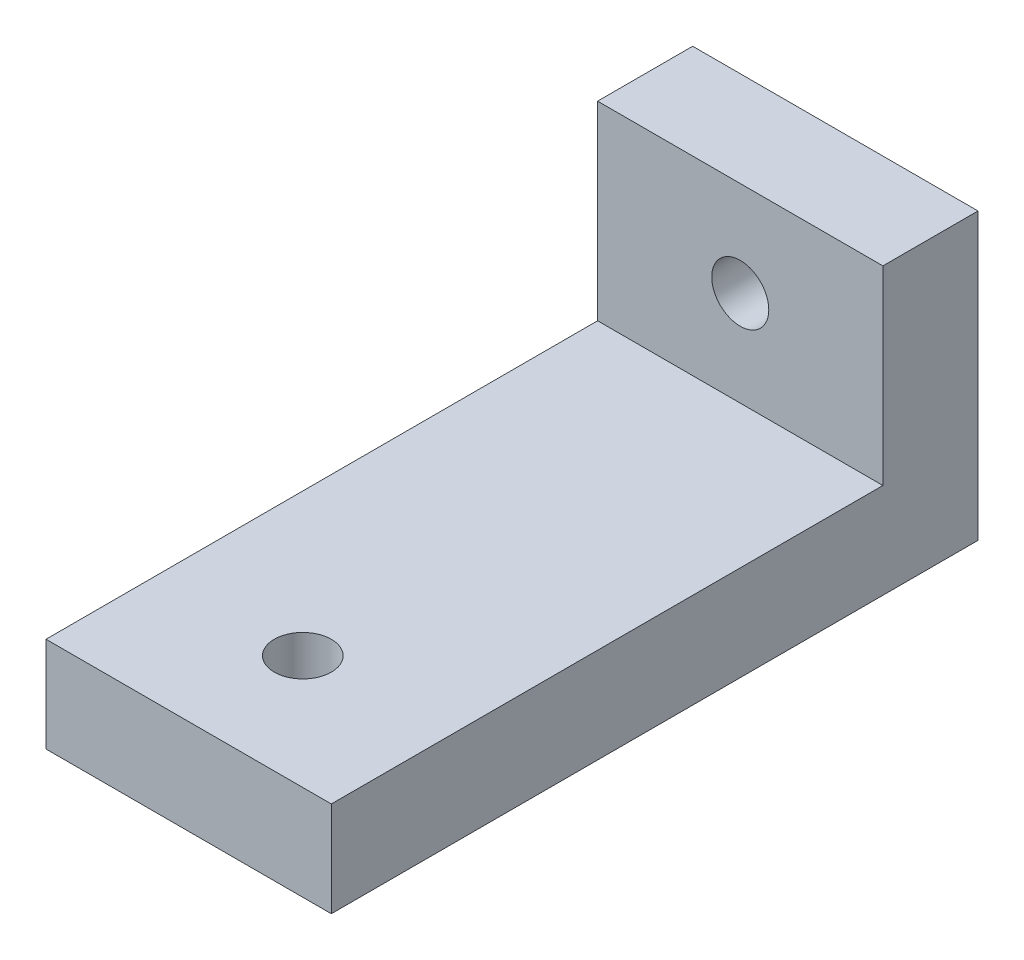
ISO-10303-21;
HEADER;
FILE_DESCRIPTION(('STEP AP214'),'2;1');
FILE_NAME('part.step','',(''),(''),'','','');
FILE_SCHEMA(('AUTOMOTIVE_DESIGN { 1 0 10303 214 1 1 1 1 }'));
ENDSEC;
DATA;
#1=APPLICATION_CONTEXT('core data for automotive mechanical design processes');
#2=APPLICATION_PROTOCOL_DEFINITION('international standard','automotive_design',2000,#1);
#3=PRODUCT_CONTEXT('',#1,'mechanical');
#4=PRODUCT('Part','Part','',(#3));
#5=PRODUCT_RELATED_PRODUCT_CATEGORY('part','',(#4));
#6=PRODUCT_DEFINITION_FORMATION('','',#4);
#7=PRODUCT_DEFINITION_CONTEXT('part definition',#1,'design');
#8=PRODUCT_DEFINITION('design','',#6,#7);
#9=PRODUCT_DEFINITION_SHAPE('','',#8);
#10=(LENGTH_UNIT() NAMED_UNIT(*) SI_UNIT(.MILLI.,.METRE.));
#11=(NAMED_UNIT(*) PLANE_ANGLE_UNIT() SI_UNIT($,.RADIAN.));
#12=(NAMED_UNIT(*) SI_UNIT($,.STERADIAN.) SOLID_ANGLE_UNIT());
#13=UNCERTAINTY_MEASURE_WITH_UNIT(LENGTH_MEASURE(1.E-05),#10,'distance_accuracy_value','');
#14=(GEOMETRIC_REPRESENTATION_CONTEXT(3) GLOBAL_UNCERTAINTY_ASSIGNED_CONTEXT((#13)) GLOBAL_UNIT_ASSIGNED_CONTEXT((#10,
#11,#12)) REPRESENTATION_CONTEXT('',''));
#15=CARTESIAN_POINT('',(0.,0.,0.));
#16=DIRECTION('',(0.,0.,1.));
#17=DIRECTION('',(1.,0.,0.));
#18=AXIS2_PLACEMENT_3D('',#15,#16,#17);
#19=CARTESIAN_POINT('',(7.5,5.,-17.25));
#20=DIRECTION('',(-1.,0.,0.));
#21=DIRECTION('',(0.,0.,1.));
#22=AXIS2_PLACEMENT_3D('',#19,#20,#21);
#23=PLANE('',#22);
#24=DIRECTION('',(0.,-1.,0.));
#25=VECTOR('',#24,1.);
#26=CARTESIAN_POINT('',(7.5,15.,-16.75));
#27=LINE('',#26,#25);
#28=CARTESIAN_POINT('',(7.5,15.,-16.75));
#29=VERTEX_POINT('',#28);
#30=CARTESIAN_POINT('',(7.5,0.,-16.75));
#31=VERTEX_POINT('',#30);
#32=EDGE_CURVE('E159',#29,#31,#27,.T.);
#33=ORIENTED_EDGE('',*,*,#32,.F.);
#34=DIRECTION('',(0.,0.,-1.));
#35=VECTOR('',#34,1.);
#36=CARTESIAN_POINT('',(7.5,15.,-17.25));
#37=LINE('',#36,#35);
#38=CARTESIAN_POINT('',(7.5,15.,-11.75));
#39=VERTEX_POINT('',#38);
#40=EDGE_CURVE('E93',#39,#29,#37,.T.);
#41=ORIENTED_EDGE('',*,*,#40,.F.);
#42=DIRECTION('',(0.,1.,0.));
#43=VECTOR('',#42,1.);
#44=CARTESIAN_POINT('',(7.5,5.,-11.75));
#45=LINE('',#44,#43);
#46=CARTESIAN_POINT('',(7.5,5.,-11.75));
#47=VERTEX_POINT('',#46);
#48=EDGE_CURVE('E152',#47,#39,#45,.T.);
#49=ORIENTED_EDGE('',*,*,#48,.F.);
#50=DIRECTION('',(0.,0.,-1.));
#51=VECTOR('',#50,1.);
#52=CARTESIAN_POINT('',(7.5,5.,-17.25));
#53=LINE('',#52,#51);
#54=CARTESIAN_POINT('',(7.5,5.,17.25));
#55=VERTEX_POINT('',#54);
#56=EDGE_CURVE('E80',#55,#47,#53,.T.);
#57=ORIENTED_EDGE('',*,*,#56,.F.);
#58=DIRECTION('',(0.,-1.,0.));
#59=VECTOR('',#58,1.);
#60=CARTESIAN_POINT('',(7.5,5.,17.25));
#61=LINE('',#60,#59);
#62=CARTESIAN_POINT('',(7.5,0.,17.25));
#63=VERTEX_POINT('',#62);
#64=EDGE_CURVE('E43',#55,#63,#61,.T.);
#65=ORIENTED_EDGE('',*,*,#64,.T.);
#66=DIRECTION('',(0.,0.,-1.));
#67=VECTOR('',#66,1.);
#68=CARTESIAN_POINT('',(7.5,0.,-17.25));
#69=LINE('',#68,#67);
#70=EDGE_CURVE('E87',#63,#31,#69,.T.);
#71=ORIENTED_EDGE('',*,*,#70,.T.);
#72=EDGE_LOOP('',(#33,#41,#49,#57,#65,#71));
#73=FACE_BOUND('',#72,.T.);
#74=ADVANCED_FACE('F35',(#73),#23,.F.);
#75=CARTESIAN_POINT('',(-7.5,5.,-17.25));
#76=DIRECTION('',(1.,0.,0.));
#77=DIRECTION('',(0.,0.,-1.));
#78=AXIS2_PLACEMENT_3D('',#75,#76,#77);
#79=PLANE('',#78);
#80=DIRECTION('',(0.,0.,1.));
#81=VECTOR('',#80,1.);
#82=CARTESIAN_POINT('',(-7.5,5.,-17.25));
#83=LINE('',#82,#81);
#84=CARTESIAN_POINT('',(-7.5,5.,-11.75));
#85=VERTEX_POINT('',#84);
#86=CARTESIAN_POINT('',(-7.5,5.,17.25));
#87=VERTEX_POINT('',#86);
#88=EDGE_CURVE('E117',#85,#87,#83,.T.);
#89=ORIENTED_EDGE('',*,*,#88,.F.);
#90=DIRECTION('',(0.,-1.,0.));
#91=VECTOR('',#90,1.);
#92=CARTESIAN_POINT('',(-7.5,15.,-11.75));
#93=LINE('',#92,#91);
#94=CARTESIAN_POINT('',(-7.5,15.,-11.75));
#95=VERTEX_POINT('',#94);
#96=EDGE_CURVE('E144',#95,#85,#93,.T.);
#97=ORIENTED_EDGE('',*,*,#96,.F.);
#98=DIRECTION('',(0.,0.,1.));
#99=VECTOR('',#98,1.);
#100=CARTESIAN_POINT('',(-7.5,15.,-17.25));
#101=LINE('',#100,#99);
#102=CARTESIAN_POINT('',(-7.5,15.,-16.75));
#103=VERTEX_POINT('',#102);
#104=EDGE_CURVE('E97',#103,#95,#101,.T.);
#105=ORIENTED_EDGE('',*,*,#104,.F.);
#106=DIRECTION('',(0.,1.,0.));
#107=VECTOR('',#106,1.);
#108=CARTESIAN_POINT('',(-7.5,0.,-16.75));
#109=LINE('',#108,#107);
#110=CARTESIAN_POINT('',(-7.5,0.,-16.75));
#111=VERTEX_POINT('',#110);
#112=EDGE_CURVE('E51',#111,#103,#109,.T.);
#113=ORIENTED_EDGE('',*,*,#112,.F.);
#114=DIRECTION('',(0.,0.,1.));
#115=VECTOR('',#114,1.);
#116=CARTESIAN_POINT('',(-7.5,0.,-17.25));
#117=LINE('',#116,#115);
#118=CARTESIAN_POINT('',(-7.5,0.,17.25));
#119=VERTEX_POINT('',#118);
#120=EDGE_CURVE('E81',#111,#119,#117,.T.);
#121=ORIENTED_EDGE('',*,*,#120,.T.);
#122=DIRECTION('',(0.,-1.,0.));
#123=VECTOR('',#122,1.);
#124=CARTESIAN_POINT('',(-7.5,5.,17.25));
#125=LINE('',#124,#123);
#126=EDGE_CURVE('E11',#87,#119,#125,.T.);
#127=ORIENTED_EDGE('',*,*,#126,.F.);
#128=EDGE_LOOP('',(#89,#97,#105,#113,#121,#127));
#129=FACE_BOUND('',#128,.T.);
#130=ADVANCED_FACE('F127',(#129),#79,.F.);
#131=CARTESIAN_POINT('',(0.,0.,0.));
#132=DIRECTION('',(0.,1.,0.));
#133=DIRECTION('',(0.,0.,1.));
#134=AXIS2_PLACEMENT_3D('',#131,#132,#133);
#135=PLANE('',#134);
#136=CARTESIAN_POINT('',(0.,0.,11.25));
#137=DIRECTION('',(0.,1.,0.));
#138=DIRECTION('',(0.,0.,1.));
#139=AXIS2_PLACEMENT_3D('',#136,#137,#138);
#140=CIRCLE('',#139,1.5);
#141=CARTESIAN_POINT('',(0.,0.,12.75));
#142=VERTEX_POINT('',#141);
#143=EDGE_CURVE('E101',#142,#142,#140,.T.);
#144=ORIENTED_EDGE('',*,*,#143,.T.);
#145=EDGE_LOOP('',(#144));
#146=FACE_BOUND('',#145,.T.);
#147=DIRECTION('',(-1.,0.,0.));
#148=VECTOR('',#147,1.);
#149=CARTESIAN_POINT('',(7.5,0.,-16.75));
#150=LINE('',#149,#148);
#151=EDGE_CURVE('E92',#31,#111,#150,.T.);
#152=ORIENTED_EDGE('',*,*,#151,.F.);
#153=ORIENTED_EDGE('',*,*,#70,.F.);
#154=DIRECTION('',(1.,0.,0.));
#155=VECTOR('',#154,1.);
#156=CARTESIAN_POINT('',(-7.5,0.,17.25));
#157=LINE('',#156,#155);
#158=EDGE_CURVE('E72',#119,#63,#157,.T.);
#159=ORIENTED_EDGE('',*,*,#158,.F.);
#160=ORIENTED_EDGE('',*,*,#120,.F.);
#161=EDGE_LOOP('',(#152,#153,#159,#160));
#162=FACE_BOUND('',#161,.T.);
#163=ADVANCED_FACE('F91',(#146,#162),#135,.F.);
#164=CARTESIAN_POINT('',(0.,15.,0.));
#165=DIRECTION('',(0.,1.,0.));
#166=DIRECTION('',(0.,0.,1.));
#167=AXIS2_PLACEMENT_3D('',#164,#165,#166);
#168=PLANE('',#167);
#169=ORIENTED_EDGE('',*,*,#40,.T.);
#170=DIRECTION('',(1.,0.,0.));
#171=VECTOR('',#170,1.);
#172=CARTESIAN_POINT('',(-7.5,15.,-16.75));
#173=LINE('',#172,#171);
#174=EDGE_CURVE('E113',#103,#29,#173,.T.);
#175=ORIENTED_EDGE('',*,*,#174,.F.);
#176=ORIENTED_EDGE('',*,*,#104,.T.);
#177=DIRECTION('',(-1.,0.,0.));
#178=VECTOR('',#177,1.);
#179=CARTESIAN_POINT('',(7.5,15.,-11.75));
#180=LINE('',#179,#178);
#181=EDGE_CURVE('E149',#39,#95,#180,.T.);
#182=ORIENTED_EDGE('',*,*,#181,.F.);
#183=EDGE_LOOP('',(#169,#175,#176,#182));
#184=FACE_BOUND('',#183,.T.);
#185=ADVANCED_FACE('F164',(#184),#168,.T.);
#186=CARTESIAN_POINT('',(0.,10.,-22.25));
#187=DIRECTION('',(0.,0.,1.));
#188=DIRECTION('',(1.,0.,0.));
#189=AXIS2_PLACEMENT_3D('',#186,#187,#188);
#190=CYLINDRICAL_SURFACE('',#189,1.5);
#191=CARTESIAN_POINT('',(0.,10.,-16.75));
#192=DIRECTION('',(0.,0.,-1.));
#193=DIRECTION('',(-1.,0.,0.));
#194=AXIS2_PLACEMENT_3D('',#191,#192,#193);
#195=CIRCLE('',#194,1.5);
#196=CARTESIAN_POINT('',(-1.5,10.,-16.75));
#197=VERTEX_POINT('',#196);
#198=EDGE_CURVE('E38',#197,#197,#195,.F.);
#199=ORIENTED_EDGE('',*,*,#198,.F.);
#200=EDGE_LOOP('',(#199));
#201=FACE_BOUND('',#200,.T.);
#202=CARTESIAN_POINT('',(0.,10.,-11.75));
#203=DIRECTION('',(0.,0.,1.));
#204=DIRECTION('',(1.,0.,0.));
#205=AXIS2_PLACEMENT_3D('',#202,#203,#204);
#206=CIRCLE('',#205,1.5);
#207=CARTESIAN_POINT('',(1.5,10.,-11.75));
#208=VERTEX_POINT('',#207);
#209=EDGE_CURVE('E150',#208,#208,#206,.T.);
#210=ORIENTED_EDGE('',*,*,#209,.T.);
#211=EDGE_LOOP('',(#210));
#212=FACE_BOUND('',#211,.T.);
#213=ADVANCED_FACE('F166',(#201,#212),#190,.F.);
#214=CARTESIAN_POINT('',(-7.5,5.,17.25));
#215=DIRECTION('',(0.,0.,-1.));
#216=DIRECTION('',(-1.,0.,0.));
#217=AXIS2_PLACEMENT_3D('',#214,#215,#216);
#218=PLANE('',#217);
#219=ORIENTED_EDGE('',*,*,#158,.T.);
#220=ORIENTED_EDGE('',*,*,#64,.F.);
#221=DIRECTION('',(1.,0.,0.));
#222=VECTOR('',#221,1.);
#223=CARTESIAN_POINT('',(-7.5,5.,17.25));
#224=LINE('',#223,#222);
#225=EDGE_CURVE('E60',#87,#55,#224,.T.);
#226=ORIENTED_EDGE('',*,*,#225,.F.);
#227=ORIENTED_EDGE('',*,*,#126,.T.);
#228=EDGE_LOOP('',(#219,#220,#226,#227));
#229=FACE_BOUND('',#228,.T.);
#230=ADVANCED_FACE('F74',(#229),#218,.F.);
#231=CARTESIAN_POINT('',(0.,5.,0.));
#232=DIRECTION('',(0.,1.,0.));
#233=DIRECTION('',(0.,0.,1.));
#234=AXIS2_PLACEMENT_3D('',#231,#232,#233);
#235=PLANE('',#234);
#236=DIRECTION('',(1.,0.,0.));
#237=VECTOR('',#236,1.);
#238=CARTESIAN_POINT('',(-7.5,5.,-11.75));
#239=LINE('',#238,#237);
#240=EDGE_CURVE('E124',#85,#47,#239,.T.);
#241=ORIENTED_EDGE('',*,*,#240,.F.);
#242=ORIENTED_EDGE('',*,*,#88,.T.);
#243=ORIENTED_EDGE('',*,*,#225,.T.);
#244=ORIENTED_EDGE('',*,*,#56,.T.);
#245=EDGE_LOOP('',(#241,#242,#243,#244));
#246=FACE_BOUND('',#245,.T.);
#247=CARTESIAN_POINT('',(0.,5.,11.25));
#248=DIRECTION('',(0.,1.,0.));
#249=DIRECTION('',(0.,0.,1.));
#250=AXIS2_PLACEMENT_3D('',#247,#248,#249);
#251=CIRCLE('',#250,1.5);
#252=CARTESIAN_POINT('',(0.,5.,12.75));
#253=VERTEX_POINT('',#252);
#254=EDGE_CURVE('E103',#253,#253,#251,.T.);
#255=ORIENTED_EDGE('',*,*,#254,.F.);
#256=EDGE_LOOP('',(#255));
#257=FACE_BOUND('',#256,.T.);
#258=ADVANCED_FACE('F120',(#246,#257),#235,.T.);
#259=CARTESIAN_POINT('',(0.,-5.,11.25));
#260=DIRECTION('',(0.,1.,0.));
#261=DIRECTION('',(0.,0.,1.));
#262=AXIS2_PLACEMENT_3D('',#259,#260,#261);
#263=CYLINDRICAL_SURFACE('',#262,1.5);
#264=ORIENTED_EDGE('',*,*,#254,.T.);
#265=EDGE_LOOP('',(#264));
#266=FACE_BOUND('',#265,.T.);
#267=ORIENTED_EDGE('',*,*,#143,.F.);
#268=EDGE_LOOP('',(#267));
#269=FACE_BOUND('',#268,.T.);
#270=ADVANCED_FACE('F186',(#266,#269),#263,.F.);
#271=CARTESIAN_POINT('',(0.,0.,-16.75));
#272=DIRECTION('',(0.,0.,-1.));
#273=DIRECTION('',(-1.,0.,0.));
#274=AXIS2_PLACEMENT_3D('',#271,#272,#273);
#275=PLANE('',#274);
#276=ORIENTED_EDGE('',*,*,#32,.T.);
#277=ORIENTED_EDGE('',*,*,#151,.T.);
#278=ORIENTED_EDGE('',*,*,#112,.T.);
#279=ORIENTED_EDGE('',*,*,#174,.T.);
#280=EDGE_LOOP('',(#276,#277,#278,#279));
#281=FACE_BOUND('',#280,.T.);
#282=ORIENTED_EDGE('',*,*,#198,.T.);
#283=EDGE_LOOP('',(#282));
#284=FACE_BOUND('',#283,.T.);
#285=ADVANCED_FACE('F161',(#281,#284),#275,.T.);
#286=CARTESIAN_POINT('',(0.,0.,-11.75));
#287=DIRECTION('',(0.,0.,1.));
#288=DIRECTION('',(1.,0.,0.));
#289=AXIS2_PLACEMENT_3D('',#286,#287,#288);
#290=PLANE('',#289);
#291=ORIENTED_EDGE('',*,*,#96,.T.);
#292=ORIENTED_EDGE('',*,*,#240,.T.);
#293=ORIENTED_EDGE('',*,*,#48,.T.);
#294=ORIENTED_EDGE('',*,*,#181,.T.);
#295=EDGE_LOOP('',(#291,#292,#293,#294));
#296=FACE_BOUND('',#295,.T.);
#297=ORIENTED_EDGE('',*,*,#209,.F.);
#298=EDGE_LOOP('',(#297));
#299=FACE_BOUND('',#298,.T.);
#300=ADVANCED_FACE('F145',(#296,#299),#290,.T.);
#301=CLOSED_SHELL('',(#74,#130,#163,#185,#213,#230,#258,#270,#285,#300));
#302=MANIFOLD_SOLID_BREP('B2',#301);
#303=ADVANCED_BREP_SHAPE_REPRESENTATION('',(#18,#302),#14);
#304=SHAPE_DEFINITION_REPRESENTATION(#9,#303);
ENDSEC;
END-ISO-10303-21;
